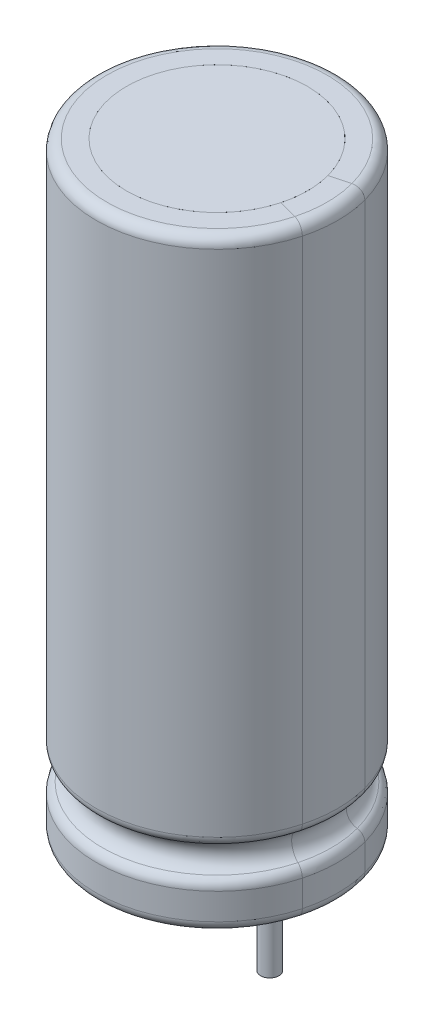
ISO-10303-21;
HEADER;
FILE_DESCRIPTION(('STEP AP214'),'2;1');
FILE_NAME('part.step','',(''),(''),'','','');
FILE_SCHEMA(('AUTOMOTIVE_DESIGN { 1 0 10303 214 1 1 1 1 }'));
ENDSEC;
DATA;
#1=APPLICATION_CONTEXT('core data for automotive mechanical design processes');
#2=APPLICATION_PROTOCOL_DEFINITION('international standard','automotive_design',2000,#1);
#3=PRODUCT_CONTEXT('',#1,'mechanical');
#4=PRODUCT('Part','Part','',(#3));
#5=PRODUCT_RELATED_PRODUCT_CATEGORY('part','',(#4));
#6=PRODUCT_DEFINITION_FORMATION('','',#4);
#7=PRODUCT_DEFINITION_CONTEXT('part definition',#1,'design');
#8=PRODUCT_DEFINITION('design','',#6,#7);
#9=PRODUCT_DEFINITION_SHAPE('','',#8);
#10=(LENGTH_UNIT() NAMED_UNIT(*) SI_UNIT(.MILLI.,.METRE.));
#11=(NAMED_UNIT(*) PLANE_ANGLE_UNIT() SI_UNIT($,.RADIAN.));
#12=(NAMED_UNIT(*) SI_UNIT($,.STERADIAN.) SOLID_ANGLE_UNIT());
#13=UNCERTAINTY_MEASURE_WITH_UNIT(LENGTH_MEASURE(1.E-05),#10,'distance_accuracy_value','');
#14=(GEOMETRIC_REPRESENTATION_CONTEXT(3) GLOBAL_UNCERTAINTY_ASSIGNED_CONTEXT((#13)) GLOBAL_UNIT_ASSIGNED_CONTEXT((#10,
#11,#12)) REPRESENTATION_CONTEXT('',''));
#15=CARTESIAN_POINT('',(0.,0.,0.));
#16=DIRECTION('',(0.,0.,1.));
#17=DIRECTION('',(1.,0.,0.));
#18=AXIS2_PLACEMENT_3D('',#15,#16,#17);
#19=CARTESIAN_POINT('',(-1.75,-3.,0.));
#20=DIRECTION('',(0.,1.,0.));
#21=DIRECTION('',(0.,0.,1.));
#22=AXIS2_PLACEMENT_3D('',#19,#20,#21);
#23=CYLINDRICAL_SURFACE('',#22,0.301076539545515);
#24=CARTESIAN_POINT('',(-1.75,-3.,0.));
#25=DIRECTION('',(0.,-1.,0.));
#26=DIRECTION('',(0.,0.,-1.));
#27=AXIS2_PLACEMENT_3D('',#24,#25,#26);
#28=CIRCLE('',#27,0.301076539545515);
#29=CARTESIAN_POINT('',(-1.75,-3.,-0.301076539545515));
#30=VERTEX_POINT('',#29);
#31=EDGE_CURVE('E48',#30,#30,#28,.T.);
#32=ORIENTED_EDGE('',*,*,#31,.F.);
#33=EDGE_LOOP('',(#32));
#34=FACE_BOUND('',#33,.T.);
#35=CARTESIAN_POINT('',(-1.75,0.,0.));
#36=DIRECTION('',(0.,-1.,0.));
#37=DIRECTION('',(0.,0.,-1.));
#38=AXIS2_PLACEMENT_3D('',#35,#36,#37);
#39=CIRCLE('',#38,0.301076539545515);
#40=CARTESIAN_POINT('',(-1.75,0.,-0.301076539545515));
#41=VERTEX_POINT('',#40);
#42=EDGE_CURVE('E11',#41,#41,#39,.T.);
#43=ORIENTED_EDGE('',*,*,#42,.T.);
#44=EDGE_LOOP('',(#43));
#45=FACE_BOUND('',#44,.T.);
#46=ADVANCED_FACE('F44',(#34,#45),#23,.T.);
#47=CARTESIAN_POINT('',(-1.75,-3.,0.));
#48=DIRECTION('',(0.,-1.,0.));
#49=DIRECTION('',(0.,0.,-1.));
#50=AXIS2_PLACEMENT_3D('',#47,#48,#49);
#51=PLANE('',#50);
#52=ORIENTED_EDGE('',*,*,#31,.T.);
#53=EDGE_LOOP('',(#52));
#54=FACE_BOUND('',#53,.T.);
#55=ADVANCED_FACE('F46',(#54),#51,.T.);
#56=CARTESIAN_POINT('',(-1.75,0.,0.));
#57=DIRECTION('',(0.,-1.,0.));
#58=DIRECTION('',(0.,0.,-1.));
#59=AXIS2_PLACEMENT_3D('',#56,#57,#58);
#60=PLANE('',#59);
#61=ORIENTED_EDGE('',*,*,#42,.F.);
#62=EDGE_LOOP('',(#61));
#63=FACE_BOUND('',#62,.T.);
#64=ADVANCED_FACE('F63',(#63),#60,.F.);
#65=CLOSED_SHELL('',(#46,#55,#64));
#66=MANIFOLD_SOLID_BREP('B2',#65);
#67=CARTESIAN_POINT('',(1.75,-3.,0.));
#68=DIRECTION('',(0.,1.,0.));
#69=DIRECTION('',(0.,0.,1.));
#70=AXIS2_PLACEMENT_3D('',#67,#68,#69);
#71=CYLINDRICAL_SURFACE('',#70,0.303024672407141);
#72=CARTESIAN_POINT('',(1.75,-3.,0.));
#73=DIRECTION('',(0.,-1.,0.));
#74=DIRECTION('',(0.,0.,-1.));
#75=AXIS2_PLACEMENT_3D('',#72,#73,#74);
#76=CIRCLE('',#75,0.303024672407141);
#77=CARTESIAN_POINT('',(1.75,-3.,-0.303024672407141));
#78=VERTEX_POINT('',#77);
#79=EDGE_CURVE('E43',#78,#78,#76,.T.);
#80=ORIENTED_EDGE('',*,*,#79,.F.);
#81=EDGE_LOOP('',(#80));
#82=FACE_BOUND('',#81,.T.);
#83=CARTESIAN_POINT('',(1.75,0.,0.));
#84=DIRECTION('',(0.,-1.,0.));
#85=DIRECTION('',(0.,0.,-1.));
#86=AXIS2_PLACEMENT_3D('',#83,#84,#85);
#87=CIRCLE('',#86,0.303024672407141);
#88=CARTESIAN_POINT('',(1.75,0.,-0.303024672407141));
#89=VERTEX_POINT('',#88);
#90=EDGE_CURVE('E98',#89,#89,#87,.T.);
#91=ORIENTED_EDGE('',*,*,#90,.T.);
#92=EDGE_LOOP('',(#91));
#93=FACE_BOUND('',#92,.T.);
#94=ADVANCED_FACE('F95',(#82,#93),#71,.T.);
#95=CARTESIAN_POINT('',(1.75,-3.,0.));
#96=DIRECTION('',(0.,-1.,0.));
#97=DIRECTION('',(0.,0.,-1.));
#98=AXIS2_PLACEMENT_3D('',#95,#96,#97);
#99=PLANE('',#98);
#100=ORIENTED_EDGE('',*,*,#79,.T.);
#101=EDGE_LOOP('',(#100));
#102=FACE_BOUND('',#101,.T.);
#103=ADVANCED_FACE('F110',(#102),#99,.T.);
#104=CARTESIAN_POINT('',(1.75,0.,0.));
#105=DIRECTION('',(0.,-1.,0.));
#106=DIRECTION('',(0.,0.,-1.));
#107=AXIS2_PLACEMENT_3D('',#104,#105,#106);
#108=PLANE('',#107);
#109=ORIENTED_EDGE('',*,*,#90,.F.);
#110=EDGE_LOOP('',(#109));
#111=FACE_BOUND('',#110,.T.);
#112=ADVANCED_FACE('F108',(#111),#108,.F.);
#113=CLOSED_SHELL('',(#94,#103,#112));
#114=MANIFOLD_SOLID_BREP('B6',#113);
#115=CARTESIAN_POINT('',(0.,20.,0.));
#116=DIRECTION('',(0.,-1.,0.));
#117=DIRECTION('',(0.,0.,-1.));
#118=AXIS2_PLACEMENT_3D('',#115,#116,#117);
#119=CYLINDRICAL_SURFACE('',#118,4.);
#120=DIRECTION('',(0.,-1.,0.));
#121=VECTOR('',#120,1.);
#122=CARTESIAN_POINT('',(3.86370330515627,20.,-1.03527618041009));
#123=LINE('',#122,#121);
#124=CARTESIAN_POINT('',(3.86370330515627,1.22540333075851,-1.03527618041009));
#125=VERTEX_POINT('',#124);
#126=CARTESIAN_POINT('',(3.86370330515627,0.35,-1.03527618041009));
#127=VERTEX_POINT('',#126);
#128=EDGE_CURVE('E258',#125,#127,#123,.T.);
#129=ORIENTED_EDGE('',*,*,#128,.T.);
#130=CARTESIAN_POINT('',(0.,0.35,0.));
#131=DIRECTION('',(0.,1.,0.));
#132=DIRECTION('',(0.,0.,1.));
#133=AXIS2_PLACEMENT_3D('',#130,#131,#132);
#134=CIRCLE('',#133,4.);
#135=CARTESIAN_POINT('',(3.86370330515627,0.35,1.03527618041009));
#136=VERTEX_POINT('',#135);
#137=EDGE_CURVE('E264',#127,#136,#134,.T.);
#138=ORIENTED_EDGE('',*,*,#137,.T.);
#139=DIRECTION('',(0.,-1.,0.));
#140=VECTOR('',#139,1.);
#141=CARTESIAN_POINT('',(3.86370330515627,20.,1.03527618041009));
#142=LINE('',#141,#140);
#143=CARTESIAN_POINT('',(3.86370330515627,1.22540333075851,1.03527618041009));
#144=VERTEX_POINT('',#143);
#145=EDGE_CURVE('E254',#144,#136,#142,.T.);
#146=ORIENTED_EDGE('',*,*,#145,.F.);
#147=CARTESIAN_POINT('',(0.,1.22540333075851,0.));
#148=DIRECTION('',(0.,-1.,0.));
#149=DIRECTION('',(0.,0.,-1.));
#150=AXIS2_PLACEMENT_3D('',#147,#148,#149);
#151=CIRCLE('',#150,4.);
#152=EDGE_CURVE('E262',#144,#125,#151,.T.);
#153=ORIENTED_EDGE('',*,*,#152,.T.);
#154=EDGE_LOOP('',(#129,#138,#146,#153));
#155=FACE_BOUND('',#154,.T.);
#156=ADVANCED_FACE('F143',(#155),#119,.T.);
#157=CARTESIAN_POINT('',(3.86370330515627,19.65,-1.03527618041009));
#158=VERTEX_POINT('',#157);
#159=CARTESIAN_POINT('',(3.86370330515627,2.77459666924148,-1.03527618041009));
#160=VERTEX_POINT('',#159);
#161=EDGE_CURVE('E231',#158,#160,#123,.T.);
#162=ORIENTED_EDGE('',*,*,#161,.T.);
#163=CARTESIAN_POINT('',(0.,2.77459666924148,0.));
#164=DIRECTION('',(0.,1.,0.));
#165=DIRECTION('',(0.,0.,1.));
#166=AXIS2_PLACEMENT_3D('',#163,#164,#165);
#167=CIRCLE('',#166,4.);
#168=CARTESIAN_POINT('',(3.86370330515627,2.77459666924148,1.03527618041009));
#169=VERTEX_POINT('',#168);
#170=EDGE_CURVE('E151',#160,#169,#167,.T.);
#171=ORIENTED_EDGE('',*,*,#170,.T.);
#172=CARTESIAN_POINT('',(3.86370330515627,19.65,1.03527618041009));
#173=VERTEX_POINT('',#172);
#174=EDGE_CURVE('E255',#173,#169,#142,.T.);
#175=ORIENTED_EDGE('',*,*,#174,.F.);
#176=CARTESIAN_POINT('',(0.,19.65,0.));
#177=DIRECTION('',(0.,1.,0.));
#178=DIRECTION('',(0.,0.,1.));
#179=AXIS2_PLACEMENT_3D('',#176,#177,#178);
#180=CIRCLE('',#179,4.);
#181=EDGE_CURVE('E289',#173,#158,#180,.F.);
#182=ORIENTED_EDGE('',*,*,#181,.T.);
#183=EDGE_LOOP('',(#162,#171,#175,#182));
#184=FACE_BOUND('',#183,.T.);
#185=ADVANCED_FACE('F293',(#184),#119,.T.);
#186=CARTESIAN_POINT('',(0.,20.,0.));
#187=DIRECTION('',(0.,-1.,0.));
#188=DIRECTION('',(0.,0.,-1.));
#189=AXIS2_PLACEMENT_3D('',#186,#187,#188);
#190=CYLINDRICAL_SURFACE('',#189,3.);
#191=CARTESIAN_POINT('',(0.,0.,0.));
#192=DIRECTION('',(0.,1.,0.));
#193=DIRECTION('',(0.,0.,1.));
#194=AXIS2_PLACEMENT_3D('',#191,#192,#193);
#195=CIRCLE('',#194,3.);
#196=CARTESIAN_POINT('',(2.8977774788672,0.,-0.776457135307564));
#197=VERTEX_POINT('',#196);
#198=CARTESIAN_POINT('',(2.8977774788672,0.,0.776457135307564));
#199=VERTEX_POINT('',#198);
#200=EDGE_CURVE('E227',#197,#199,#195,.T.);
#201=ORIENTED_EDGE('',*,*,#200,.F.);
#202=DIRECTION('',(0.,-1.,0.));
#203=VECTOR('',#202,1.);
#204=CARTESIAN_POINT('',(2.8977774788672,20.,-0.776457135307564));
#205=LINE('',#204,#203);
#206=CARTESIAN_POINT('',(2.8977774788672,20.,-0.776457135307564));
#207=VERTEX_POINT('',#206);
#208=EDGE_CURVE('E221',#207,#197,#205,.T.);
#209=ORIENTED_EDGE('',*,*,#208,.F.);
#210=CARTESIAN_POINT('',(0.,20.,0.));
#211=DIRECTION('',(0.,1.,0.));
#212=DIRECTION('',(0.,0.,1.));
#213=AXIS2_PLACEMENT_3D('',#210,#211,#212);
#214=CIRCLE('',#213,3.);
#215=CARTESIAN_POINT('',(2.8977774788672,20.,0.776457135307564));
#216=VERTEX_POINT('',#215);
#217=EDGE_CURVE('E224',#207,#216,#214,.T.);
#218=ORIENTED_EDGE('',*,*,#217,.T.);
#219=DIRECTION('',(0.,-1.,0.));
#220=VECTOR('',#219,1.);
#221=CARTESIAN_POINT('',(2.8977774788672,20.,0.776457135307564));
#222=LINE('',#221,#220);
#223=EDGE_CURVE('E250',#216,#199,#222,.T.);
#224=ORIENTED_EDGE('',*,*,#223,.T.);
#225=EDGE_LOOP('',(#201,#209,#218,#224));
#226=FACE_BOUND('',#225,.T.);
#227=ADVANCED_FACE('F222',(#226),#190,.F.);
#228=CARTESIAN_POINT('',(0.,20.,0.));
#229=DIRECTION('',(-0.258819045102521,0.,-0.965925826289068));
#230=DIRECTION('',(-0.965925826289068,0.,0.258819045102521));
#231=AXIS2_PLACEMENT_3D('',#228,#229,#230);
#232=PLANE('',#231);
#233=DIRECTION('',(0.965925826289068,0.,-0.258819045102521));
#234=VECTOR('',#233,1.);
#235=CARTESIAN_POINT('',(0.,0.,0.));
#236=LINE('',#235,#234);
#237=CARTESIAN_POINT('',(3.5256292659551,0.,-0.944689514624204));
#238=VERTEX_POINT('',#237);
#239=EDGE_CURVE('E244',#197,#238,#236,.T.);
#240=ORIENTED_EDGE('',*,*,#239,.T.);
#241=CARTESIAN_POINT('',(3.5256292659551,0.35,-0.944689514624203));
#242=DIRECTION('',(-0.258819045102521,0.,-0.965925826289068));
#243=DIRECTION('',(-0.965925826289068,0.,0.258819045102521));
#244=AXIS2_PLACEMENT_3D('',#241,#242,#243);
#245=CIRCLE('',#244,0.35);
#246=EDGE_CURVE('E281',#238,#127,#245,.F.);
#247=ORIENTED_EDGE('',*,*,#246,.T.);
#248=ORIENTED_EDGE('',*,*,#128,.F.);
#249=CARTESIAN_POINT('',(3.5256292659551,1.22540333075851,-0.944689514624203));
#250=DIRECTION('',(-0.258819045102521,0.,-0.965925826289068));
#251=DIRECTION('',(-0.965925826289068,0.,0.258819045102521));
#252=AXIS2_PLACEMENT_3D('',#249,#250,#251);
#253=CIRCLE('',#252,0.35);
#254=CARTESIAN_POINT('',(3.66483622327323,1.54435490044618,-0.98198990641839));
#255=VERTEX_POINT('',#254);
#256=EDGE_CURVE('E279',#125,#255,#253,.F.);
#257=ORIENTED_EDGE('',*,*,#256,.T.);
#258=CARTESIAN_POINT('',(3.86370330515627,2.,-1.03527618041009));
#259=DIRECTION('',(-0.258819045102521,0.,-0.965925826289068));
#260=DIRECTION('',(-0.965925826289068,0.,0.258819045102521));
#261=AXIS2_PLACEMENT_3D('',#258,#259,#260);
#262=CIRCLE('',#261,0.5);
#263=CARTESIAN_POINT('',(3.66483622327323,2.45564509955381,-0.98198990641839));
#264=VERTEX_POINT('',#263);
#265=EDGE_CURVE('E247',#264,#255,#262,.F.);
#266=ORIENTED_EDGE('',*,*,#265,.F.);
#267=CARTESIAN_POINT('',(3.5256292659551,2.77459666924148,-0.944689514624203));
#268=DIRECTION('',(-0.258819045102521,0.,-0.965925826289068));
#269=DIRECTION('',(-0.965925826289068,0.,0.258819045102521));
#270=AXIS2_PLACEMENT_3D('',#267,#268,#269);
#271=CIRCLE('',#270,0.35);
#272=EDGE_CURVE('E164',#264,#160,#271,.F.);
#273=ORIENTED_EDGE('',*,*,#272,.T.);
#274=ORIENTED_EDGE('',*,*,#161,.F.);
#275=CARTESIAN_POINT('',(3.5256292659551,19.65,-0.944689514624203));
#276=DIRECTION('',(-0.258819045102521,0.,-0.965925826289068));
#277=DIRECTION('',(-0.965925826289068,0.,0.258819045102521));
#278=AXIS2_PLACEMENT_3D('',#275,#276,#277);
#279=CIRCLE('',#278,0.35);
#280=CARTESIAN_POINT('',(3.5256292659551,20.,-0.944689514624204));
#281=VERTEX_POINT('',#280);
#282=EDGE_CURVE('E158',#158,#281,#279,.F.);
#283=ORIENTED_EDGE('',*,*,#282,.T.);
#284=DIRECTION('',(0.965925826289068,0.,-0.258819045102521));
#285=VECTOR('',#284,1.);
#286=CARTESIAN_POINT('',(0.,20.,0.));
#287=LINE('',#286,#285);
#288=EDGE_CURVE('E233',#207,#281,#287,.T.);
#289=ORIENTED_EDGE('',*,*,#288,.F.);
#290=ORIENTED_EDGE('',*,*,#208,.T.);
#291=EDGE_LOOP('',(#240,#247,#248,#257,#266,#273,#274,#283,#289,#290));
#292=FACE_BOUND('',#291,.T.);
#293=ADVANCED_FACE('F234',(#292),#232,.F.);
#294=CARTESIAN_POINT('',(0.,20.,0.));
#295=DIRECTION('',(0.258819045102522,0.,-0.965925826289068));
#296=DIRECTION('',(-0.965925826289068,0.,-0.258819045102522));
#297=AXIS2_PLACEMENT_3D('',#294,#295,#296);
#298=PLANE('',#297);
#299=ORIENTED_EDGE('',*,*,#145,.T.);
#300=CARTESIAN_POINT('',(3.5256292659551,0.35,0.944689514624204));
#301=DIRECTION('',(0.258819045102522,0.,-0.965925826289068));
#302=DIRECTION('',(-0.965925826289068,0.,-0.258819045102522));
#303=AXIS2_PLACEMENT_3D('',#300,#301,#302);
#304=CIRCLE('',#303,0.35);
#305=CARTESIAN_POINT('',(3.5256292659551,0.,0.944689514624203));
#306=VERTEX_POINT('',#305);
#307=EDGE_CURVE('E273',#136,#306,#304,.T.);
#308=ORIENTED_EDGE('',*,*,#307,.T.);
#309=DIRECTION('',(0.965925826289068,0.,0.258819045102522));
#310=VECTOR('',#309,1.);
#311=CARTESIAN_POINT('',(0.,0.,0.));
#312=LINE('',#311,#310);
#313=EDGE_CURVE('E241',#199,#306,#312,.T.);
#314=ORIENTED_EDGE('',*,*,#313,.F.);
#315=ORIENTED_EDGE('',*,*,#223,.F.);
#316=DIRECTION('',(0.965925826289068,0.,0.258819045102522));
#317=VECTOR('',#316,1.);
#318=CARTESIAN_POINT('',(0.,20.,0.));
#319=LINE('',#318,#317);
#320=CARTESIAN_POINT('',(3.5256292659551,20.,0.944689514624203));
#321=VERTEX_POINT('',#320);
#322=EDGE_CURVE('E237',#216,#321,#319,.T.);
#323=ORIENTED_EDGE('',*,*,#322,.T.);
#324=CARTESIAN_POINT('',(3.5256292659551,19.65,0.944689514624204));
#325=DIRECTION('',(0.258819045102522,0.,-0.965925826289068));
#326=DIRECTION('',(-0.965925826289068,0.,-0.258819045102522));
#327=AXIS2_PLACEMENT_3D('',#324,#325,#326);
#328=CIRCLE('',#327,0.35);
#329=EDGE_CURVE('E267',#321,#173,#328,.T.);
#330=ORIENTED_EDGE('',*,*,#329,.T.);
#331=ORIENTED_EDGE('',*,*,#174,.T.);
#332=CARTESIAN_POINT('',(3.5256292659551,2.77459666924148,0.944689514624204));
#333=DIRECTION('',(0.258819045102522,0.,-0.965925826289068));
#334=DIRECTION('',(-0.965925826289068,0.,-0.258819045102522));
#335=AXIS2_PLACEMENT_3D('',#332,#333,#334);
#336=CIRCLE('',#335,0.35);
#337=CARTESIAN_POINT('',(3.66483622327323,2.45564509955381,0.981989906418391));
#338=VERTEX_POINT('',#337);
#339=EDGE_CURVE('E269',#169,#338,#336,.T.);
#340=ORIENTED_EDGE('',*,*,#339,.T.);
#341=CARTESIAN_POINT('',(3.86370330515627,2.,1.03527618041009));
#342=DIRECTION('',(0.258819045102522,0.,-0.965925826289068));
#343=DIRECTION('',(-0.965925826289068,0.,-0.258819045102522));
#344=AXIS2_PLACEMENT_3D('',#341,#342,#343);
#345=CIRCLE('',#344,0.5);
#346=CARTESIAN_POINT('',(3.66483622327323,1.54435490044618,0.981989906418391));
#347=VERTEX_POINT('',#346);
#348=EDGE_CURVE('E230',#338,#347,#345,.F.);
#349=ORIENTED_EDGE('',*,*,#348,.T.);
#350=CARTESIAN_POINT('',(3.5256292659551,1.22540333075851,0.944689514624204));
#351=DIRECTION('',(0.258819045102522,0.,-0.965925826289068));
#352=DIRECTION('',(-0.965925826289068,0.,-0.258819045102522));
#353=AXIS2_PLACEMENT_3D('',#350,#351,#352);
#354=CIRCLE('',#353,0.35);
#355=EDGE_CURVE('E271',#347,#144,#354,.T.);
#356=ORIENTED_EDGE('',*,*,#355,.T.);
#357=EDGE_LOOP('',(#299,#308,#314,#315,#323,#330,#331,#340,#349,#356));
#358=FACE_BOUND('',#357,.T.);
#359=ADVANCED_FACE('F299',(#358),#298,.T.);
#360=CARTESIAN_POINT('',(0.,20.,0.));
#361=DIRECTION('',(0.,1.,0.));
#362=DIRECTION('',(0.,0.,1.));
#363=AXIS2_PLACEMENT_3D('',#360,#361,#362);
#364=PLANE('',#363);
#365=ORIENTED_EDGE('',*,*,#288,.T.);
#366=CARTESIAN_POINT('',(0.,20.,0.));
#367=DIRECTION('',(0.,1.,0.));
#368=DIRECTION('',(0.,0.,1.));
#369=AXIS2_PLACEMENT_3D('',#366,#367,#368);
#370=CIRCLE('',#369,3.65);
#371=EDGE_CURVE('E93',#281,#321,#370,.T.);
#372=ORIENTED_EDGE('',*,*,#371,.T.);
#373=ORIENTED_EDGE('',*,*,#322,.F.);
#374=ORIENTED_EDGE('',*,*,#217,.F.);
#375=EDGE_LOOP('',(#365,#372,#373,#374));
#376=FACE_BOUND('',#375,.T.);
#377=ADVANCED_FACE('F239',(#376),#364,.T.);
#378=CARTESIAN_POINT('',(0.,0.,0.));
#379=DIRECTION('',(0.,1.,0.));
#380=DIRECTION('',(0.,0.,1.));
#381=AXIS2_PLACEMENT_3D('',#378,#379,#380);
#382=PLANE('',#381);
#383=ORIENTED_EDGE('',*,*,#313,.T.);
#384=CARTESIAN_POINT('',(0.,0.,0.));
#385=DIRECTION('',(0.,1.,0.));
#386=DIRECTION('',(0.,0.,1.));
#387=AXIS2_PLACEMENT_3D('',#384,#385,#386);
#388=CIRCLE('',#387,3.65);
#389=EDGE_CURVE('E275',#306,#238,#388,.F.);
#390=ORIENTED_EDGE('',*,*,#389,.T.);
#391=ORIENTED_EDGE('',*,*,#239,.F.);
#392=ORIENTED_EDGE('',*,*,#200,.T.);
#393=EDGE_LOOP('',(#383,#390,#391,#392));
#394=FACE_BOUND('',#393,.T.);
#395=ADVANCED_FACE('F322',(#394),#382,.F.);
#396=CARTESIAN_POINT('',(0.,2.,0.));
#397=DIRECTION('',(0.,-1.,0.));
#398=DIRECTION('',(0.,0.,-1.));
#399=AXIS2_PLACEMENT_3D('',#396,#397,#398);
#400=TOROIDAL_SURFACE('',#399,4.,0.5);
#401=ORIENTED_EDGE('',*,*,#265,.T.);
#402=CARTESIAN_POINT('',(0.,1.54435490044618,0.));
#403=DIRECTION('',(0.,1.,0.));
#404=DIRECTION('',(0.,0.,1.));
#405=AXIS2_PLACEMENT_3D('',#402,#403,#404);
#406=CIRCLE('',#405,3.79411764705882);
#407=EDGE_CURVE('E286',#255,#347,#406,.T.);
#408=ORIENTED_EDGE('',*,*,#407,.T.);
#409=ORIENTED_EDGE('',*,*,#348,.F.);
#410=CARTESIAN_POINT('',(0.,2.45564509955382,0.));
#411=DIRECTION('',(0.,-1.,0.));
#412=DIRECTION('',(0.,0.,-1.));
#413=AXIS2_PLACEMENT_3D('',#410,#411,#412);
#414=CIRCLE('',#413,3.79411764705882);
#415=EDGE_CURVE('E283',#338,#264,#414,.T.);
#416=ORIENTED_EDGE('',*,*,#415,.T.);
#417=EDGE_LOOP('',(#401,#408,#409,#416));
#418=FACE_BOUND('',#417,.T.);
#419=ADVANCED_FACE('F305',(#418),#400,.F.);
#420=CARTESIAN_POINT('',(0.,0.35,0.));
#421=DIRECTION('',(0.,1.,0.));
#422=DIRECTION('',(0.,0.,1.));
#423=AXIS2_PLACEMENT_3D('',#420,#421,#422);
#424=TOROIDAL_SURFACE('',#423,3.65,0.35);
#425=ORIENTED_EDGE('',*,*,#246,.F.);
#426=ORIENTED_EDGE('',*,*,#389,.F.);
#427=ORIENTED_EDGE('',*,*,#307,.F.);
#428=ORIENTED_EDGE('',*,*,#137,.F.);
#429=EDGE_LOOP('',(#425,#426,#427,#428));
#430=FACE_BOUND('',#429,.T.);
#431=ADVANCED_FACE('F318',(#430),#424,.T.);
#432=CARTESIAN_POINT('',(0.,1.22540333075851,0.));
#433=DIRECTION('',(0.,-1.,0.));
#434=DIRECTION('',(0.,0.,-1.));
#435=AXIS2_PLACEMENT_3D('',#432,#433,#434);
#436=TOROIDAL_SURFACE('',#435,3.65,0.35);
#437=ORIENTED_EDGE('',*,*,#256,.F.);
#438=ORIENTED_EDGE('',*,*,#152,.F.);
#439=ORIENTED_EDGE('',*,*,#355,.F.);
#440=ORIENTED_EDGE('',*,*,#407,.F.);
#441=EDGE_LOOP('',(#437,#438,#439,#440));
#442=FACE_BOUND('',#441,.T.);
#443=ADVANCED_FACE('F312',(#442),#436,.T.);
#444=CARTESIAN_POINT('',(0.,2.77459666924148,0.));
#445=DIRECTION('',(0.,1.,0.));
#446=DIRECTION('',(0.,0.,1.));
#447=AXIS2_PLACEMENT_3D('',#444,#445,#446);
#448=TOROIDAL_SURFACE('',#447,3.65,0.35);
#449=ORIENTED_EDGE('',*,*,#339,.F.);
#450=ORIENTED_EDGE('',*,*,#170,.F.);
#451=ORIENTED_EDGE('',*,*,#272,.F.);
#452=ORIENTED_EDGE('',*,*,#415,.F.);
#453=EDGE_LOOP('',(#449,#450,#451,#452));
#454=FACE_BOUND('',#453,.T.);
#455=ADVANCED_FACE('F302',(#454),#448,.T.);
#456=CARTESIAN_POINT('',(0.,19.65,0.));
#457=DIRECTION('',(0.,1.,0.));
#458=DIRECTION('',(0.,0.,1.));
#459=AXIS2_PLACEMENT_3D('',#456,#457,#458);
#460=TOROIDAL_SURFACE('',#459,3.65,0.35);
#461=ORIENTED_EDGE('',*,*,#282,.F.);
#462=ORIENTED_EDGE('',*,*,#181,.F.);
#463=ORIENTED_EDGE('',*,*,#329,.F.);
#464=ORIENTED_EDGE('',*,*,#371,.F.);
#465=EDGE_LOOP('',(#461,#462,#463,#464));
#466=FACE_BOUND('',#465,.T.);
#467=ADVANCED_FACE('F145',(#466),#460,.T.);
#468=CLOSED_SHELL('',(#156,#185,#227,#293,#359,#377,#395,#419,#431,#443,#455,#467));
#469=MANIFOLD_SOLID_BREP('B38',#468);
#470=CARTESIAN_POINT('',(0.,20.,0.));
#471=DIRECTION('',(0.,-1.,0.));
#472=DIRECTION('',(0.,0.,-1.));
#473=AXIS2_PLACEMENT_3D('',#470,#471,#472);
#474=CYLINDRICAL_SURFACE('',#473,3.);
#475=CARTESIAN_POINT('',(0.,20.,0.));
#476=DIRECTION('',(0.,1.,0.));
#477=DIRECTION('',(0.,0.,1.));
#478=AXIS2_PLACEMENT_3D('',#475,#476,#477);
#479=CIRCLE('',#478,3.);
#480=CARTESIAN_POINT('',(0.,20.,3.));
#481=VERTEX_POINT('',#480);
#482=EDGE_CURVE('E142',#481,#481,#479,.T.);
#483=ORIENTED_EDGE('',*,*,#482,.F.);
#484=EDGE_LOOP('',(#483));
#485=FACE_BOUND('',#484,.T.);
#486=CARTESIAN_POINT('',(0.,0.,0.));
#487=DIRECTION('',(0.,1.,0.));
#488=DIRECTION('',(0.,0.,1.));
#489=AXIS2_PLACEMENT_3D('',#486,#487,#488);
#490=CIRCLE('',#489,3.);
#491=CARTESIAN_POINT('',(0.,0.,3.));
#492=VERTEX_POINT('',#491);
#493=EDGE_CURVE('E431',#492,#492,#490,.T.);
#494=ORIENTED_EDGE('',*,*,#493,.T.);
#495=EDGE_LOOP('',(#494));
#496=FACE_BOUND('',#495,.T.);
#497=ADVANCED_FACE('F428',(#485,#496),#474,.T.);
#498=CARTESIAN_POINT('',(0.,20.,0.));
#499=DIRECTION('',(0.,1.,0.));
#500=DIRECTION('',(0.,0.,1.));
#501=AXIS2_PLACEMENT_3D('',#498,#499,#500);
#502=PLANE('',#501);
#503=ORIENTED_EDGE('',*,*,#482,.T.);
#504=EDGE_LOOP('',(#503));
#505=FACE_BOUND('',#504,.T.);
#506=ADVANCED_FACE('F443',(#505),#502,.T.);
#507=CARTESIAN_POINT('',(0.,0.,0.));
#508=DIRECTION('',(0.,1.,0.));
#509=DIRECTION('',(0.,0.,1.));
#510=AXIS2_PLACEMENT_3D('',#507,#508,#509);
#511=PLANE('',#510);
#512=ORIENTED_EDGE('',*,*,#493,.F.);
#513=EDGE_LOOP('',(#512));
#514=FACE_BOUND('',#513,.T.);
#515=ADVANCED_FACE('F441',(#514),#511,.F.);
#516=CLOSED_SHELL('',(#497,#506,#515));
#517=MANIFOLD_SOLID_BREP('B87',#516);
#518=CARTESIAN_POINT('',(0.,20.,0.));
#519=DIRECTION('',(0.,-1.,0.));
#520=DIRECTION('',(0.,0.,-1.));
#521=AXIS2_PLACEMENT_3D('',#518,#519,#520);
#522=CYLINDRICAL_SURFACE('',#521,4.);
#523=DIRECTION('',(0.,-1.,0.));
#524=VECTOR('',#523,1.);
#525=CARTESIAN_POINT('',(3.86370330515627,20.,1.03527618041009));
#526=LINE('',#525,#524);
#527=CARTESIAN_POINT('',(3.86370330515627,1.22540333075851,1.03527618041009));
#528=VERTEX_POINT('',#527);
#529=CARTESIAN_POINT('',(3.86370330515627,0.35,1.03527618041009));
#530=VERTEX_POINT('',#529);
#531=EDGE_CURVE('E583',#528,#530,#526,.T.);
#532=ORIENTED_EDGE('',*,*,#531,.T.);
#533=CARTESIAN_POINT('',(0.,0.35,0.));
#534=DIRECTION('',(0.,1.,0.));
#535=DIRECTION('',(0.,0.,1.));
#536=AXIS2_PLACEMENT_3D('',#533,#534,#535);
#537=CIRCLE('',#536,4.);
#538=CARTESIAN_POINT('',(3.86370330515627,0.35,-1.03527618041009));
#539=VERTEX_POINT('',#538);
#540=EDGE_CURVE('E589',#530,#539,#537,.T.);
#541=ORIENTED_EDGE('',*,*,#540,.T.);
#542=DIRECTION('',(0.,-1.,0.));
#543=VECTOR('',#542,1.);
#544=CARTESIAN_POINT('',(3.86370330515627,20.,-1.03527618041009));
#545=LINE('',#544,#543);
#546=CARTESIAN_POINT('',(3.86370330515627,1.22540333075851,-1.03527618041009));
#547=VERTEX_POINT('',#546);
#548=EDGE_CURVE('E579',#547,#539,#545,.T.);
#549=ORIENTED_EDGE('',*,*,#548,.F.);
#550=CARTESIAN_POINT('',(0.,1.22540333075851,0.));
#551=DIRECTION('',(0.,-1.,0.));
#552=DIRECTION('',(0.,0.,-1.));
#553=AXIS2_PLACEMENT_3D('',#550,#551,#552);
#554=CIRCLE('',#553,4.);
#555=EDGE_CURVE('E587',#547,#528,#554,.T.);
#556=ORIENTED_EDGE('',*,*,#555,.T.);
#557=EDGE_LOOP('',(#532,#541,#549,#556));
#558=FACE_BOUND('',#557,.T.);
#559=ADVANCED_FACE('F468',(#558),#522,.T.);
#560=CARTESIAN_POINT('',(3.86370330515627,19.65,1.03527618041009));
#561=VERTEX_POINT('',#560);
#562=CARTESIAN_POINT('',(3.86370330515627,2.77459666924148,1.03527618041009));
#563=VERTEX_POINT('',#562);
#564=EDGE_CURVE('E556',#561,#563,#526,.T.);
#565=ORIENTED_EDGE('',*,*,#564,.T.);
#566=CARTESIAN_POINT('',(0.,2.77459666924148,0.));
#567=DIRECTION('',(0.,1.,0.));
#568=DIRECTION('',(0.,0.,1.));
#569=AXIS2_PLACEMENT_3D('',#566,#567,#568);
#570=CIRCLE('',#569,4.);
#571=CARTESIAN_POINT('',(3.86370330515627,2.77459666924148,-1.03527618041009));
#572=VERTEX_POINT('',#571);
#573=EDGE_CURVE('E476',#563,#572,#570,.T.);
#574=ORIENTED_EDGE('',*,*,#573,.T.);
#575=CARTESIAN_POINT('',(3.86370330515627,19.65,-1.03527618041009));
#576=VERTEX_POINT('',#575);
#577=EDGE_CURVE('E580',#576,#572,#545,.T.);
#578=ORIENTED_EDGE('',*,*,#577,.F.);
#579=CARTESIAN_POINT('',(0.,19.65,0.));
#580=DIRECTION('',(0.,1.,0.));
#581=DIRECTION('',(0.,0.,1.));
#582=AXIS2_PLACEMENT_3D('',#579,#580,#581);
#583=CIRCLE('',#582,4.);
#584=EDGE_CURVE('E614',#576,#561,#583,.F.);
#585=ORIENTED_EDGE('',*,*,#584,.T.);
#586=EDGE_LOOP('',(#565,#574,#578,#585));
#587=FACE_BOUND('',#586,.T.);
#588=ADVANCED_FACE('F618',(#587),#522,.T.);
#589=CARTESIAN_POINT('',(0.,20.,0.));
#590=DIRECTION('',(0.,-1.,0.));
#591=DIRECTION('',(0.,0.,-1.));
#592=AXIS2_PLACEMENT_3D('',#589,#590,#591);
#593=CYLINDRICAL_SURFACE('',#592,3.);
#594=CARTESIAN_POINT('',(0.,0.,0.));
#595=DIRECTION('',(0.,1.,0.));
#596=DIRECTION('',(0.,0.,1.));
#597=AXIS2_PLACEMENT_3D('',#594,#595,#596);
#598=CIRCLE('',#597,3.);
#599=CARTESIAN_POINT('',(2.8977774788672,0.,0.776457135307564));
#600=VERTEX_POINT('',#599);
#601=CARTESIAN_POINT('',(2.8977774788672,0.,-0.776457135307564));
#602=VERTEX_POINT('',#601);
#603=EDGE_CURVE('E552',#600,#602,#598,.T.);
#604=ORIENTED_EDGE('',*,*,#603,.F.);
#605=DIRECTION('',(0.,-1.,0.));
#606=VECTOR('',#605,1.);
#607=CARTESIAN_POINT('',(2.8977774788672,20.,0.776457135307564));
#608=LINE('',#607,#606);
#609=CARTESIAN_POINT('',(2.8977774788672,20.,0.776457135307564));
#610=VERTEX_POINT('',#609);
#611=EDGE_CURVE('E546',#610,#600,#608,.T.);
#612=ORIENTED_EDGE('',*,*,#611,.F.);
#613=CARTESIAN_POINT('',(0.,20.,0.));
#614=DIRECTION('',(0.,1.,0.));
#615=DIRECTION('',(0.,0.,1.));
#616=AXIS2_PLACEMENT_3D('',#613,#614,#615);
#617=CIRCLE('',#616,3.);
#618=CARTESIAN_POINT('',(2.8977774788672,20.,-0.776457135307564));
#619=VERTEX_POINT('',#618);
#620=EDGE_CURVE('E549',#610,#619,#617,.T.);
#621=ORIENTED_EDGE('',*,*,#620,.T.);
#622=DIRECTION('',(0.,-1.,0.));
#623=VECTOR('',#622,1.);
#624=CARTESIAN_POINT('',(2.8977774788672,20.,-0.776457135307564));
#625=LINE('',#624,#623);
#626=EDGE_CURVE('E575',#619,#602,#625,.T.);
#627=ORIENTED_EDGE('',*,*,#626,.T.);
#628=EDGE_LOOP('',(#604,#612,#621,#627));
#629=FACE_BOUND('',#628,.T.);
#630=ADVANCED_FACE('F547',(#629),#593,.F.);
#631=CARTESIAN_POINT('',(0.,20.,0.));
#632=DIRECTION('',(0.258819045102522,0.,-0.965925826289068));
#633=DIRECTION('',(-0.965925826289068,0.,-0.258819045102522));
#634=AXIS2_PLACEMENT_3D('',#631,#632,#633);
#635=PLANE('',#634);
#636=DIRECTION('',(0.965925826289068,0.,0.258819045102522));
#637=VECTOR('',#636,1.);
#638=CARTESIAN_POINT('',(0.,0.,0.));
#639=LINE('',#638,#637);
#640=CARTESIAN_POINT('',(3.5256292659551,0.,0.944689514624203));
#641=VERTEX_POINT('',#640);
#642=EDGE_CURVE('E569',#600,#641,#639,.T.);
#643=ORIENTED_EDGE('',*,*,#642,.T.);
#644=CARTESIAN_POINT('',(3.5256292659551,0.35,0.944689514624204));
#645=DIRECTION('',(0.258819045102522,0.,-0.965925826289068));
#646=DIRECTION('',(-0.965925826289068,0.,-0.258819045102522));
#647=AXIS2_PLACEMENT_3D('',#644,#645,#646);
#648=CIRCLE('',#647,0.35);
#649=EDGE_CURVE('E606',#641,#530,#648,.F.);
#650=ORIENTED_EDGE('',*,*,#649,.T.);
#651=ORIENTED_EDGE('',*,*,#531,.F.);
#652=CARTESIAN_POINT('',(3.5256292659551,1.22540333075851,0.944689514624204));
#653=DIRECTION('',(0.258819045102522,0.,-0.965925826289068));
#654=DIRECTION('',(-0.965925826289068,0.,-0.258819045102522));
#655=AXIS2_PLACEMENT_3D('',#652,#653,#654);
#656=CIRCLE('',#655,0.35);
#657=CARTESIAN_POINT('',(3.66483622327323,1.54435490044618,0.98198990641839));
#658=VERTEX_POINT('',#657);
#659=EDGE_CURVE('E604',#528,#658,#656,.F.);
#660=ORIENTED_EDGE('',*,*,#659,.T.);
#661=CARTESIAN_POINT('',(3.86370330515627,2.,1.03527618041009));
#662=DIRECTION('',(0.258819045102522,0.,-0.965925826289068));
#663=DIRECTION('',(-0.965925826289068,0.,-0.258819045102522));
#664=AXIS2_PLACEMENT_3D('',#661,#662,#663);
#665=CIRCLE('',#664,0.5);
#666=CARTESIAN_POINT('',(3.66483622327323,2.45564509955381,0.981989906418391));
#667=VERTEX_POINT('',#666);
#668=EDGE_CURVE('E572',#667,#658,#665,.F.);
#669=ORIENTED_EDGE('',*,*,#668,.F.);
#670=CARTESIAN_POINT('',(3.5256292659551,2.77459666924148,0.944689514624204));
#671=DIRECTION('',(0.258819045102522,0.,-0.965925826289068));
#672=DIRECTION('',(-0.965925826289068,0.,-0.258819045102522));
#673=AXIS2_PLACEMENT_3D('',#670,#671,#672);
#674=CIRCLE('',#673,0.35);
#675=EDGE_CURVE('E489',#667,#563,#674,.F.);
#676=ORIENTED_EDGE('',*,*,#675,.T.);
#677=ORIENTED_EDGE('',*,*,#564,.F.);
#678=CARTESIAN_POINT('',(3.5256292659551,19.65,0.944689514624204));
#679=DIRECTION('',(0.258819045102522,0.,-0.965925826289068));
#680=DIRECTION('',(-0.965925826289068,0.,-0.258819045102522));
#681=AXIS2_PLACEMENT_3D('',#678,#679,#680);
#682=CIRCLE('',#681,0.35);
#683=CARTESIAN_POINT('',(3.5256292659551,20.,0.944689514624203));
#684=VERTEX_POINT('',#683);
#685=EDGE_CURVE('E483',#561,#684,#682,.F.);
#686=ORIENTED_EDGE('',*,*,#685,.T.);
#687=DIRECTION('',(0.965925826289068,0.,0.258819045102522));
#688=VECTOR('',#687,1.);
#689=CARTESIAN_POINT('',(0.,20.,0.));
#690=LINE('',#689,#688);
#691=EDGE_CURVE('E558',#610,#684,#690,.T.);
#692=ORIENTED_EDGE('',*,*,#691,.F.);
#693=ORIENTED_EDGE('',*,*,#611,.T.);
#694=EDGE_LOOP('',(#643,#650,#651,#660,#669,#676,#677,#686,#692,#693));
#695=FACE_BOUND('',#694,.T.);
#696=ADVANCED_FACE('F559',(#695),#635,.F.);
#697=CARTESIAN_POINT('',(0.,20.,0.));
#698=DIRECTION('',(-0.258819045102521,0.,-0.965925826289068));
#699=DIRECTION('',(-0.965925826289068,0.,0.258819045102521));
#700=AXIS2_PLACEMENT_3D('',#697,#698,#699);
#701=PLANE('',#700);
#702=ORIENTED_EDGE('',*,*,#548,.T.);
#703=CARTESIAN_POINT('',(3.5256292659551,0.35,-0.944689514624203));
#704=DIRECTION('',(-0.258819045102521,0.,-0.965925826289068));
#705=DIRECTION('',(-0.965925826289068,0.,0.258819045102521));
#706=AXIS2_PLACEMENT_3D('',#703,#704,#705);
#707=CIRCLE('',#706,0.35);
#708=CARTESIAN_POINT('',(3.5256292659551,0.,-0.944689514624204));
#709=VERTEX_POINT('',#708);
#710=EDGE_CURVE('E598',#539,#709,#707,.T.);
#711=ORIENTED_EDGE('',*,*,#710,.T.);
#712=DIRECTION('',(0.965925826289068,0.,-0.258819045102521));
#713=VECTOR('',#712,1.);
#714=CARTESIAN_POINT('',(0.,0.,0.));
#715=LINE('',#714,#713);
#716=EDGE_CURVE('E566',#602,#709,#715,.T.);
#717=ORIENTED_EDGE('',*,*,#716,.F.);
#718=ORIENTED_EDGE('',*,*,#626,.F.);
#719=DIRECTION('',(0.965925826289068,0.,-0.258819045102521));
#720=VECTOR('',#719,1.);
#721=CARTESIAN_POINT('',(0.,20.,0.));
#722=LINE('',#721,#720);
#723=CARTESIAN_POINT('',(3.5256292659551,20.,-0.944689514624204));
#724=VERTEX_POINT('',#723);
#725=EDGE_CURVE('E562',#619,#724,#722,.T.);
#726=ORIENTED_EDGE('',*,*,#725,.T.);
#727=CARTESIAN_POINT('',(3.5256292659551,19.65,-0.944689514624203));
#728=DIRECTION('',(-0.258819045102521,0.,-0.965925826289068));
#729=DIRECTION('',(-0.965925826289068,0.,0.258819045102521));
#730=AXIS2_PLACEMENT_3D('',#727,#728,#729);
#731=CIRCLE('',#730,0.35);
#732=EDGE_CURVE('E592',#724,#576,#731,.T.);
#733=ORIENTED_EDGE('',*,*,#732,.T.);
#734=ORIENTED_EDGE('',*,*,#577,.T.);
#735=CARTESIAN_POINT('',(3.5256292659551,2.77459666924148,-0.944689514624203));
#736=DIRECTION('',(-0.258819045102521,0.,-0.965925826289068));
#737=DIRECTION('',(-0.965925826289068,0.,0.258819045102521));
#738=AXIS2_PLACEMENT_3D('',#735,#736,#737);
#739=CIRCLE('',#738,0.35);
#740=CARTESIAN_POINT('',(3.66483622327323,2.45564509955381,-0.98198990641839));
#741=VERTEX_POINT('',#740);
#742=EDGE_CURVE('E594',#572,#741,#739,.T.);
#743=ORIENTED_EDGE('',*,*,#742,.T.);
#744=CARTESIAN_POINT('',(3.86370330515627,2.,-1.03527618041009));
#745=DIRECTION('',(-0.258819045102521,0.,-0.965925826289068));
#746=DIRECTION('',(-0.965925826289068,0.,0.258819045102521));
#747=AXIS2_PLACEMENT_3D('',#744,#745,#746);
#748=CIRCLE('',#747,0.5);
#749=CARTESIAN_POINT('',(3.66483622327323,1.54435490044618,-0.98198990641839));
#750=VERTEX_POINT('',#749);
#751=EDGE_CURVE('E555',#741,#750,#748,.F.);
#752=ORIENTED_EDGE('',*,*,#751,.T.);
#753=CARTESIAN_POINT('',(3.5256292659551,1.22540333075851,-0.944689514624203));
#754=DIRECTION('',(-0.258819045102521,0.,-0.965925826289068));
#755=DIRECTION('',(-0.965925826289068,0.,0.258819045102521));
#756=AXIS2_PLACEMENT_3D('',#753,#754,#755);
#757=CIRCLE('',#756,0.35);
#758=EDGE_CURVE('E596',#750,#547,#757,.T.);
#759=ORIENTED_EDGE('',*,*,#758,.T.);
#760=EDGE_LOOP('',(#702,#711,#717,#718,#726,#733,#734,#743,#752,#759));
#761=FACE_BOUND('',#760,.T.);
#762=ADVANCED_FACE('F624',(#761),#701,.T.);
#763=CARTESIAN_POINT('',(0.,20.,0.));
#764=DIRECTION('',(0.,1.,0.));
#765=DIRECTION('',(0.,0.,1.));
#766=AXIS2_PLACEMENT_3D('',#763,#764,#765);
#767=PLANE('',#766);
#768=ORIENTED_EDGE('',*,*,#691,.T.);
#769=CARTESIAN_POINT('',(0.,20.,0.));
#770=DIRECTION('',(0.,1.,0.));
#771=DIRECTION('',(0.,0.,1.));
#772=AXIS2_PLACEMENT_3D('',#769,#770,#771);
#773=CIRCLE('',#772,3.65);
#774=EDGE_CURVE('E426',#684,#724,#773,.T.);
#775=ORIENTED_EDGE('',*,*,#774,.T.);
#776=ORIENTED_EDGE('',*,*,#725,.F.);
#777=ORIENTED_EDGE('',*,*,#620,.F.);
#778=EDGE_LOOP('',(#768,#775,#776,#777));
#779=FACE_BOUND('',#778,.T.);
#780=ADVANCED_FACE('F564',(#779),#767,.T.);
#781=CARTESIAN_POINT('',(0.,0.,0.));
#782=DIRECTION('',(0.,1.,0.));
#783=DIRECTION('',(0.,0.,1.));
#784=AXIS2_PLACEMENT_3D('',#781,#782,#783);
#785=PLANE('',#784);
#786=ORIENTED_EDGE('',*,*,#716,.T.);
#787=CARTESIAN_POINT('',(0.,0.,0.));
#788=DIRECTION('',(0.,1.,0.));
#789=DIRECTION('',(0.,0.,1.));
#790=AXIS2_PLACEMENT_3D('',#787,#788,#789);
#791=CIRCLE('',#790,3.65);
#792=EDGE_CURVE('E600',#709,#641,#791,.F.);
#793=ORIENTED_EDGE('',*,*,#792,.T.);
#794=ORIENTED_EDGE('',*,*,#642,.F.);
#795=ORIENTED_EDGE('',*,*,#603,.T.);
#796=EDGE_LOOP('',(#786,#793,#794,#795));
#797=FACE_BOUND('',#796,.T.);
#798=ADVANCED_FACE('F647',(#797),#785,.F.);
#799=CARTESIAN_POINT('',(0.,2.,0.));
#800=DIRECTION('',(0.,-1.,0.));
#801=DIRECTION('',(0.,0.,-1.));
#802=AXIS2_PLACEMENT_3D('',#799,#800,#801);
#803=TOROIDAL_SURFACE('',#802,4.,0.5);
#804=ORIENTED_EDGE('',*,*,#668,.T.);
#805=CARTESIAN_POINT('',(0.,1.54435490044616,0.));
#806=DIRECTION('',(0.,1.,0.));
#807=DIRECTION('',(0.,0.,1.));
#808=AXIS2_PLACEMENT_3D('',#805,#806,#807);
#809=CIRCLE('',#808,3.79411764705881);
#810=EDGE_CURVE('E611',#658,#750,#809,.T.);
#811=ORIENTED_EDGE('',*,*,#810,.T.);
#812=ORIENTED_EDGE('',*,*,#751,.F.);
#813=CARTESIAN_POINT('',(0.,2.45564509955382,0.));
#814=DIRECTION('',(0.,-1.,0.));
#815=DIRECTION('',(0.,0.,-1.));
#816=AXIS2_PLACEMENT_3D('',#813,#814,#815);
#817=CIRCLE('',#816,3.79411764705882);
#818=EDGE_CURVE('E608',#741,#667,#817,.T.);
#819=ORIENTED_EDGE('',*,*,#818,.T.);
#820=EDGE_LOOP('',(#804,#811,#812,#819));
#821=FACE_BOUND('',#820,.T.);
#822=ADVANCED_FACE('F630',(#821),#803,.F.);
#823=CARTESIAN_POINT('',(0.,0.35,0.));
#824=DIRECTION('',(0.,1.,0.));
#825=DIRECTION('',(0.,0.,1.));
#826=AXIS2_PLACEMENT_3D('',#823,#824,#825);
#827=TOROIDAL_SURFACE('',#826,3.65,0.35);
#828=ORIENTED_EDGE('',*,*,#649,.F.);
#829=ORIENTED_EDGE('',*,*,#792,.F.);
#830=ORIENTED_EDGE('',*,*,#710,.F.);
#831=ORIENTED_EDGE('',*,*,#540,.F.);
#832=EDGE_LOOP('',(#828,#829,#830,#831));
#833=FACE_BOUND('',#832,.T.);
#834=ADVANCED_FACE('F643',(#833),#827,.T.);
#835=CARTESIAN_POINT('',(0.,1.22540333075851,0.));
#836=DIRECTION('',(0.,-1.,0.));
#837=DIRECTION('',(0.,0.,-1.));
#838=AXIS2_PLACEMENT_3D('',#835,#836,#837);
#839=TOROIDAL_SURFACE('',#838,3.65,0.35);
#840=ORIENTED_EDGE('',*,*,#659,.F.);
#841=ORIENTED_EDGE('',*,*,#555,.F.);
#842=ORIENTED_EDGE('',*,*,#758,.F.);
#843=ORIENTED_EDGE('',*,*,#810,.F.);
#844=EDGE_LOOP('',(#840,#841,#842,#843));
#845=FACE_BOUND('',#844,.T.);
#846=ADVANCED_FACE('F637',(#845),#839,.T.);
#847=CARTESIAN_POINT('',(0.,2.77459666924148,0.));
#848=DIRECTION('',(0.,1.,0.));
#849=DIRECTION('',(0.,0.,1.));
#850=AXIS2_PLACEMENT_3D('',#847,#848,#849);
#851=TOROIDAL_SURFACE('',#850,3.65,0.35);
#852=ORIENTED_EDGE('',*,*,#742,.F.);
#853=ORIENTED_EDGE('',*,*,#573,.F.);
#854=ORIENTED_EDGE('',*,*,#675,.F.);
#855=ORIENTED_EDGE('',*,*,#818,.F.);
#856=EDGE_LOOP('',(#852,#853,#854,#855));
#857=FACE_BOUND('',#856,.T.);
#858=ADVANCED_FACE('F627',(#857),#851,.T.);
#859=CARTESIAN_POINT('',(0.,19.65,0.));
#860=DIRECTION('',(0.,1.,0.));
#861=DIRECTION('',(0.,0.,1.));
#862=AXIS2_PLACEMENT_3D('',#859,#860,#861);
#863=TOROIDAL_SURFACE('',#862,3.65,0.35);
#864=ORIENTED_EDGE('',*,*,#685,.F.);
#865=ORIENTED_EDGE('',*,*,#584,.F.);
#866=ORIENTED_EDGE('',*,*,#732,.F.);
#867=ORIENTED_EDGE('',*,*,#774,.F.);
#868=EDGE_LOOP('',(#864,#865,#866,#867));
#869=FACE_BOUND('',#868,.T.);
#870=ADVANCED_FACE('F470',(#869),#863,.T.);
#871=CLOSED_SHELL('',(#559,#588,#630,#696,#762,#780,#798,#822,#834,#846,#858,#870));
#872=MANIFOLD_SOLID_BREP('B137',#871);
#873=ADVANCED_BREP_SHAPE_REPRESENTATION('',(#18,#66,#114,#469,#517,#872),#14);
#874=SHAPE_DEFINITION_REPRESENTATION(#9,#873);
ENDSEC;
END-ISO-10303-21;
